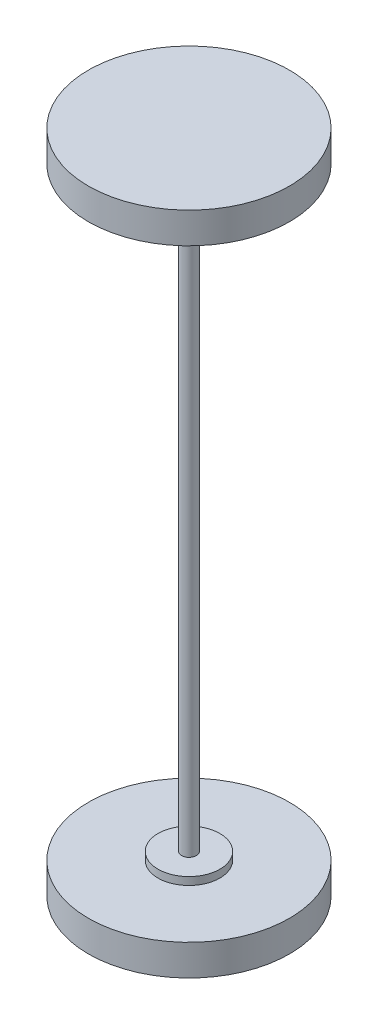
ISO-10303-21;
HEADER;
FILE_DESCRIPTION(('STEP AP214'),'2;1');
FILE_NAME('part.step','',(''),(''),'','','');
FILE_SCHEMA(('AUTOMOTIVE_DESIGN { 1 0 10303 214 1 1 1 1 }'));
ENDSEC;
DATA;
#1=APPLICATION_CONTEXT('core data for automotive mechanical design processes');
#2=APPLICATION_PROTOCOL_DEFINITION('international standard','automotive_design',2000,#1);
#3=PRODUCT_CONTEXT('',#1,'mechanical');
#4=PRODUCT('Part','Part','',(#3));
#5=PRODUCT_RELATED_PRODUCT_CATEGORY('part','',(#4));
#6=PRODUCT_DEFINITION_FORMATION('','',#4);
#7=PRODUCT_DEFINITION_CONTEXT('part definition',#1,'design');
#8=PRODUCT_DEFINITION('design','',#6,#7);
#9=PRODUCT_DEFINITION_SHAPE('','',#8);
#10=(LENGTH_UNIT() NAMED_UNIT(*) SI_UNIT(.MILLI.,.METRE.));
#11=(NAMED_UNIT(*) PLANE_ANGLE_UNIT() SI_UNIT($,.RADIAN.));
#12=(NAMED_UNIT(*) SI_UNIT($,.STERADIAN.) SOLID_ANGLE_UNIT());
#13=UNCERTAINTY_MEASURE_WITH_UNIT(LENGTH_MEASURE(1.E-05),#10,'distance_accuracy_value','');
#14=(GEOMETRIC_REPRESENTATION_CONTEXT(3) GLOBAL_UNCERTAINTY_ASSIGNED_CONTEXT((#13)) GLOBAL_UNIT_ASSIGNED_CONTEXT((#10,
#11,#12)) REPRESENTATION_CONTEXT('',''));
#15=CARTESIAN_POINT('',(0.,0.,0.));
#16=DIRECTION('',(0.,0.,1.));
#17=DIRECTION('',(1.,0.,0.));
#18=AXIS2_PLACEMENT_3D('',#15,#16,#17);
#19=CARTESIAN_POINT('',(0.,5.,0.));
#20=DIRECTION('',(0.,-1.,0.));
#21=DIRECTION('',(0.,0.,-1.));
#22=AXIS2_PLACEMENT_3D('',#19,#20,#21);
#23=CYLINDRICAL_SURFACE('',#22,32.5);
#24=CARTESIAN_POINT('',(0.,5.,0.));
#25=DIRECTION('',(0.,1.,0.));
#26=DIRECTION('',(0.,0.,1.));
#27=AXIS2_PLACEMENT_3D('',#24,#25,#26);
#28=CIRCLE('',#27,32.5);
#29=CARTESIAN_POINT('',(0.,5.,32.5));
#30=VERTEX_POINT('',#29);
#31=EDGE_CURVE('E51',#30,#30,#28,.T.);
#32=ORIENTED_EDGE('',*,*,#31,.F.);
#33=EDGE_LOOP('',(#32));
#34=FACE_BOUND('',#33,.T.);
#35=CARTESIAN_POINT('',(0.,-5.,0.));
#36=DIRECTION('',(0.,1.,0.));
#37=DIRECTION('',(0.,0.,1.));
#38=AXIS2_PLACEMENT_3D('',#35,#36,#37);
#39=CIRCLE('',#38,32.5);
#40=CARTESIAN_POINT('',(0.,-5.,32.5));
#41=VERTEX_POINT('',#40);
#42=EDGE_CURVE('E60',#41,#41,#39,.T.);
#43=ORIENTED_EDGE('',*,*,#42,.T.);
#44=EDGE_LOOP('',(#43));
#45=FACE_BOUND('',#44,.T.);
#46=ADVANCED_FACE('F43',(#34,#45),#23,.T.);
#47=CARTESIAN_POINT('',(0.,5.,0.));
#48=DIRECTION('',(0.,1.,0.));
#49=DIRECTION('',(0.,0.,1.));
#50=AXIS2_PLACEMENT_3D('',#47,#48,#49);
#51=PLANE('',#50);
#52=CARTESIAN_POINT('',(0.,5.,0.));
#53=DIRECTION('',(0.,1.,0.));
#54=DIRECTION('',(0.,0.,1.));
#55=AXIS2_PLACEMENT_3D('',#52,#53,#54);
#56=CIRCLE('',#55,10.);
#57=CARTESIAN_POINT('',(0.,5.,10.));
#58=VERTEX_POINT('',#57);
#59=EDGE_CURVE('E46',#58,#58,#56,.F.);
#60=ORIENTED_EDGE('',*,*,#59,.T.);
#61=EDGE_LOOP('',(#60));
#62=FACE_BOUND('',#61,.T.);
#63=ORIENTED_EDGE('',*,*,#31,.T.);
#64=EDGE_LOOP('',(#63));
#65=FACE_BOUND('',#64,.T.);
#66=ADVANCED_FACE('F73',(#62,#65),#51,.T.);
#67=CARTESIAN_POINT('',(0.,-5.,0.));
#68=DIRECTION('',(0.,1.,0.));
#69=DIRECTION('',(0.,0.,1.));
#70=AXIS2_PLACEMENT_3D('',#67,#68,#69);
#71=PLANE('',#70);
#72=ORIENTED_EDGE('',*,*,#42,.F.);
#73=EDGE_LOOP('',(#72));
#74=FACE_BOUND('',#73,.T.);
#75=ADVANCED_FACE('F85',(#74),#71,.F.);
#76=CARTESIAN_POINT('',(0.,7.5,0.));
#77=DIRECTION('',(0.,-1.,0.));
#78=DIRECTION('',(0.,0.,-1.));
#79=AXIS2_PLACEMENT_3D('',#76,#77,#78);
#80=CYLINDRICAL_SURFACE('',#79,10.);
#81=ORIENTED_EDGE('',*,*,#59,.F.);
#82=EDGE_LOOP('',(#81));
#83=FACE_BOUND('',#82,.T.);
#84=CARTESIAN_POINT('',(0.,7.5,0.));
#85=DIRECTION('',(0.,1.,0.));
#86=DIRECTION('',(0.,0.,1.));
#87=AXIS2_PLACEMENT_3D('',#84,#85,#86);
#88=CIRCLE('',#87,10.);
#89=CARTESIAN_POINT('',(0.,7.5,10.));
#90=VERTEX_POINT('',#89);
#91=EDGE_CURVE('E61',#90,#90,#88,.T.);
#92=ORIENTED_EDGE('',*,*,#91,.F.);
#93=EDGE_LOOP('',(#92));
#94=FACE_BOUND('',#93,.T.);
#95=ADVANCED_FACE('F76',(#83,#94),#80,.T.);
#96=CARTESIAN_POINT('',(0.,7.5,0.));
#97=DIRECTION('',(0.,1.,0.));
#98=DIRECTION('',(0.,0.,1.));
#99=AXIS2_PLACEMENT_3D('',#96,#97,#98);
#100=PLANE('',#99);
#101=CARTESIAN_POINT('',(0.,7.5,0.));
#102=DIRECTION('',(0.,1.,0.));
#103=DIRECTION('',(0.,0.,1.));
#104=AXIS2_PLACEMENT_3D('',#101,#102,#103);
#105=CIRCLE('',#104,2.4);
#106=CARTESIAN_POINT('',(0.,7.5,2.4));
#107=VERTEX_POINT('',#106);
#108=EDGE_CURVE('E10',#107,#107,#105,.T.);
#109=ORIENTED_EDGE('',*,*,#108,.F.);
#110=EDGE_LOOP('',(#109));
#111=FACE_BOUND('',#110,.T.);
#112=ORIENTED_EDGE('',*,*,#91,.T.);
#113=EDGE_LOOP('',(#112));
#114=FACE_BOUND('',#113,.T.);
#115=ADVANCED_FACE('F81',(#111,#114),#100,.T.);
#116=CARTESIAN_POINT('',(0.,102.5,0.));
#117=DIRECTION('',(0.,-1.,0.));
#118=DIRECTION('',(0.,0.,-1.));
#119=AXIS2_PLACEMENT_3D('',#116,#117,#118);
#120=CYLINDRICAL_SURFACE('',#119,2.4);
#121=ORIENTED_EDGE('',*,*,#108,.T.);
#122=EDGE_LOOP('',(#121));
#123=FACE_BOUND('',#122,.T.);
#124=CARTESIAN_POINT('',(0.,197.5,0.));
#125=DIRECTION('',(0.,1.,0.));
#126=DIRECTION('',(0.,0.,1.));
#127=AXIS2_PLACEMENT_3D('',#124,#125,#126);
#128=CIRCLE('',#127,2.4);
#129=CARTESIAN_POINT('',(0.,197.5,2.4));
#130=VERTEX_POINT('',#129);
#131=EDGE_CURVE('E66',#130,#130,#128,.T.);
#132=ORIENTED_EDGE('',*,*,#131,.F.);
#133=EDGE_LOOP('',(#132));
#134=FACE_BOUND('',#133,.T.);
#135=ADVANCED_FACE('F87',(#123,#134),#120,.T.);
#136=CARTESIAN_POINT('',(0.,200.,0.));
#137=DIRECTION('',(0.,1.,0.));
#138=DIRECTION('',(0.,0.,-1.));
#139=AXIS2_PLACEMENT_3D('',#136,#137,#138);
#140=CYLINDRICAL_SURFACE('',#139,32.5);
#141=CARTESIAN_POINT('',(0.,200.,0.));
#142=DIRECTION('',(0.,1.,0.));
#143=DIRECTION('',(0.,0.,1.));
#144=AXIS2_PLACEMENT_3D('',#141,#142,#143);
#145=CIRCLE('',#144,32.5);
#146=CARTESIAN_POINT('',(0.,200.,32.5));
#147=VERTEX_POINT('',#146);
#148=EDGE_CURVE('E205',#147,#147,#145,.T.);
#149=ORIENTED_EDGE('',*,*,#148,.T.);
#150=EDGE_LOOP('',(#149));
#151=FACE_BOUND('',#150,.T.);
#152=CARTESIAN_POINT('',(0.,210.,0.));
#153=DIRECTION('',(0.,1.,0.));
#154=DIRECTION('',(0.,0.,1.));
#155=AXIS2_PLACEMENT_3D('',#152,#153,#154);
#156=CIRCLE('',#155,32.5);
#157=CARTESIAN_POINT('',(0.,210.,32.5));
#158=VERTEX_POINT('',#157);
#159=EDGE_CURVE('E200',#158,#158,#156,.T.);
#160=ORIENTED_EDGE('',*,*,#159,.F.);
#161=EDGE_LOOP('',(#160));
#162=FACE_BOUND('',#161,.T.);
#163=ADVANCED_FACE('F94',(#151,#162),#140,.T.);
#164=CARTESIAN_POINT('',(0.,200.,0.));
#165=DIRECTION('',(0.,-1.,0.));
#166=DIRECTION('',(0.,0.,1.));
#167=AXIS2_PLACEMENT_3D('',#164,#165,#166);
#168=PLANE('',#167);
#169=CARTESIAN_POINT('',(0.,200.,0.));
#170=DIRECTION('',(0.,1.,0.));
#171=DIRECTION('',(0.,0.,1.));
#172=AXIS2_PLACEMENT_3D('',#169,#170,#171);
#173=CIRCLE('',#172,10.);
#174=CARTESIAN_POINT('',(0.,200.,10.));
#175=VERTEX_POINT('',#174);
#176=EDGE_CURVE('E63',#175,#175,#173,.F.);
#177=ORIENTED_EDGE('',*,*,#176,.F.);
#178=EDGE_LOOP('',(#177));
#179=FACE_BOUND('',#178,.T.);
#180=ORIENTED_EDGE('',*,*,#148,.F.);
#181=EDGE_LOOP('',(#180));
#182=FACE_BOUND('',#181,.T.);
#183=ADVANCED_FACE('F116',(#179,#182),#168,.T.);
#184=CARTESIAN_POINT('',(0.,210.,0.));
#185=DIRECTION('',(0.,-1.,0.));
#186=DIRECTION('',(0.,0.,1.));
#187=AXIS2_PLACEMENT_3D('',#184,#185,#186);
#188=PLANE('',#187);
#189=ORIENTED_EDGE('',*,*,#159,.T.);
#190=EDGE_LOOP('',(#189));
#191=FACE_BOUND('',#190,.T.);
#192=ADVANCED_FACE('F130',(#191),#188,.F.);
#193=CARTESIAN_POINT('',(0.,197.5,0.));
#194=DIRECTION('',(0.,1.,0.));
#195=DIRECTION('',(0.,0.,-1.));
#196=AXIS2_PLACEMENT_3D('',#193,#194,#195);
#197=CYLINDRICAL_SURFACE('',#196,10.);
#198=ORIENTED_EDGE('',*,*,#176,.T.);
#199=EDGE_LOOP('',(#198));
#200=FACE_BOUND('',#199,.T.);
#201=CARTESIAN_POINT('',(0.,197.5,0.));
#202=DIRECTION('',(0.,1.,0.));
#203=DIRECTION('',(0.,0.,1.));
#204=AXIS2_PLACEMENT_3D('',#201,#202,#203);
#205=CIRCLE('',#204,10.);
#206=CARTESIAN_POINT('',(0.,197.5,10.));
#207=VERTEX_POINT('',#206);
#208=EDGE_CURVE('E193',#207,#207,#205,.T.);
#209=ORIENTED_EDGE('',*,*,#208,.T.);
#210=EDGE_LOOP('',(#209));
#211=FACE_BOUND('',#210,.T.);
#212=ADVANCED_FACE('F136',(#200,#211),#197,.T.);
#213=CARTESIAN_POINT('',(0.,197.5,0.));
#214=DIRECTION('',(0.,-1.,0.));
#215=DIRECTION('',(0.,0.,1.));
#216=AXIS2_PLACEMENT_3D('',#213,#214,#215);
#217=PLANE('',#216);
#218=ORIENTED_EDGE('',*,*,#131,.T.);
#219=EDGE_LOOP('',(#218));
#220=FACE_BOUND('',#219,.T.);
#221=ORIENTED_EDGE('',*,*,#208,.F.);
#222=EDGE_LOOP('',(#221));
#223=FACE_BOUND('',#222,.T.);
#224=ADVANCED_FACE('F144',(#220,#223),#217,.T.);
#225=CLOSED_SHELL('',(#46,#66,#75,#95,#115,#135,#163,#183,#192,#212,#224));
#226=MANIFOLD_SOLID_BREP('B2',#225);
#227=ADVANCED_BREP_SHAPE_REPRESENTATION('',(#18,#226),#14);
#228=SHAPE_DEFINITION_REPRESENTATION(#9,#227);
ENDSEC;
END-ISO-10303-21;
